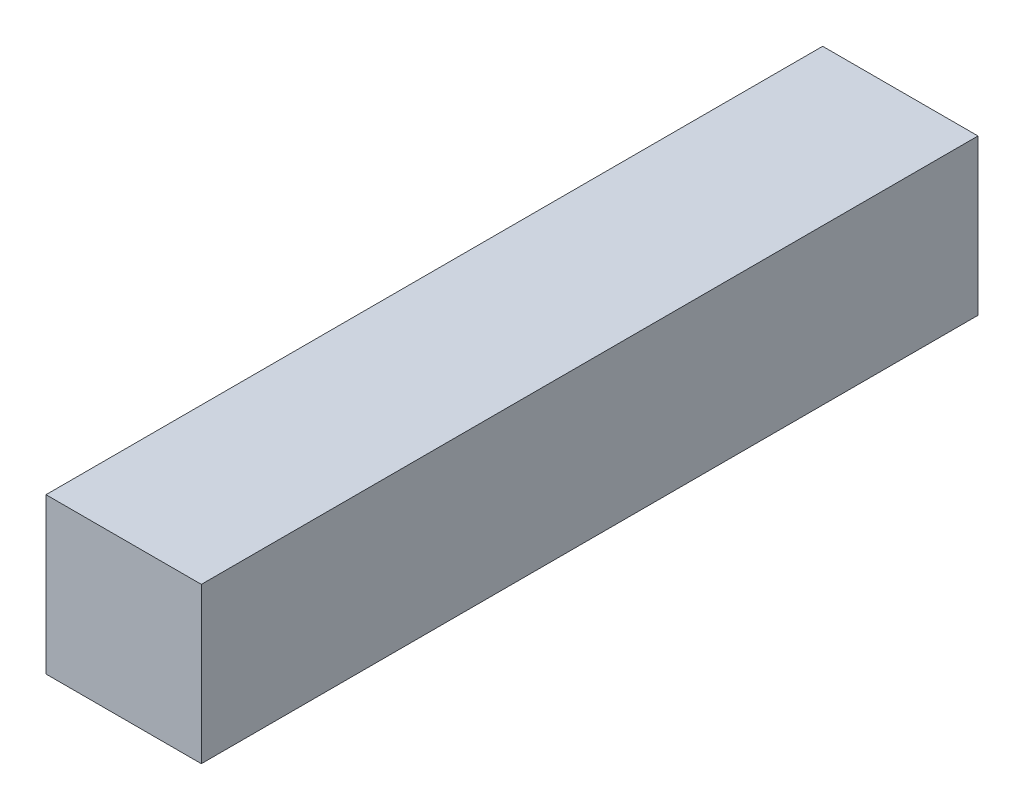
ISO-10303-21;
HEADER;
FILE_DESCRIPTION(('STEP AP214'),'2;1');
FILE_NAME('part.step','',(''),(''),'','','');
FILE_SCHEMA(('AUTOMOTIVE_DESIGN { 1 0 10303 214 1 1 1 1 }'));
ENDSEC;
DATA;
#1=APPLICATION_CONTEXT('core data for automotive mechanical design processes');
#2=APPLICATION_PROTOCOL_DEFINITION('international standard','automotive_design',2000,#1);
#3=PRODUCT_CONTEXT('',#1,'mechanical');
#4=PRODUCT('Part','Part','',(#3));
#5=PRODUCT_RELATED_PRODUCT_CATEGORY('part','',(#4));
#6=PRODUCT_DEFINITION_FORMATION('','',#4);
#7=PRODUCT_DEFINITION_CONTEXT('part definition',#1,'design');
#8=PRODUCT_DEFINITION('design','',#6,#7);
#9=PRODUCT_DEFINITION_SHAPE('','',#8);
#10=(LENGTH_UNIT() NAMED_UNIT(*) SI_UNIT(.MILLI.,.METRE.));
#11=(NAMED_UNIT(*) PLANE_ANGLE_UNIT() SI_UNIT($,.RADIAN.));
#12=(NAMED_UNIT(*) SI_UNIT($,.STERADIAN.) SOLID_ANGLE_UNIT());
#13=UNCERTAINTY_MEASURE_WITH_UNIT(LENGTH_MEASURE(1.E-05),#10,'distance_accuracy_value','');
#14=(GEOMETRIC_REPRESENTATION_CONTEXT(3) GLOBAL_UNCERTAINTY_ASSIGNED_CONTEXT((#13)) GLOBAL_UNIT_ASSIGNED_CONTEXT((#10,
#11,#12)) REPRESENTATION_CONTEXT('',''));
#15=CARTESIAN_POINT('',(0.,0.,0.));
#16=DIRECTION('',(0.,0.,1.));
#17=DIRECTION('',(1.,0.,0.));
#18=AXIS2_PLACEMENT_3D('',#15,#16,#17);
#19=CARTESIAN_POINT('',(-2.,-2.,20.));
#20=DIRECTION('',(0.,1.,0.));
#21=DIRECTION('',(-1.,0.,0.));
#22=AXIS2_PLACEMENT_3D('',#19,#20,#21);
#23=PLANE('',#22);
#24=DIRECTION('',(1.,0.,0.));
#25=VECTOR('',#24,1.);
#26=CARTESIAN_POINT('',(-2.,-2.,0.));
#27=LINE('',#26,#25);
#28=CARTESIAN_POINT('',(-2.,-2.,0.));
#29=VERTEX_POINT('',#28);
#30=CARTESIAN_POINT('',(2.,-2.,0.));
#31=VERTEX_POINT('',#30);
#32=EDGE_CURVE('E105',#29,#31,#27,.T.);
#33=ORIENTED_EDGE('',*,*,#32,.T.);
#34=DIRECTION('',(0.,0.,-1.));
#35=VECTOR('',#34,1.);
#36=CARTESIAN_POINT('',(2.,-2.,20.));
#37=LINE('',#36,#35);
#38=CARTESIAN_POINT('',(2.,-2.,20.));
#39=VERTEX_POINT('',#38);
#40=EDGE_CURVE('E11',#39,#31,#37,.T.);
#41=ORIENTED_EDGE('',*,*,#40,.F.);
#42=DIRECTION('',(1.,0.,0.));
#43=VECTOR('',#42,1.);
#44=CARTESIAN_POINT('',(-2.,-2.,20.));
#45=LINE('',#44,#43);
#46=CARTESIAN_POINT('',(-2.,-2.,20.));
#47=VERTEX_POINT('',#46);
#48=EDGE_CURVE('E89',#47,#39,#45,.T.);
#49=ORIENTED_EDGE('',*,*,#48,.F.);
#50=DIRECTION('',(0.,0.,-1.));
#51=VECTOR('',#50,1.);
#52=CARTESIAN_POINT('',(-2.,-2.,20.));
#53=LINE('',#52,#51);
#54=EDGE_CURVE('E97',#47,#29,#53,.T.);
#55=ORIENTED_EDGE('',*,*,#54,.T.);
#56=EDGE_LOOP('',(#33,#41,#49,#55));
#57=FACE_BOUND('',#56,.T.);
#58=ADVANCED_FACE('F39',(#57),#23,.F.);
#59=CARTESIAN_POINT('',(2.,2.,20.));
#60=DIRECTION('',(-1.,0.,0.));
#61=DIRECTION('',(0.,-1.,0.));
#62=AXIS2_PLACEMENT_3D('',#59,#60,#61);
#63=PLANE('',#62);
#64=DIRECTION('',(0.,1.,0.));
#65=VECTOR('',#64,1.);
#66=CARTESIAN_POINT('',(2.,2.,0.));
#67=LINE('',#66,#65);
#68=CARTESIAN_POINT('',(2.,2.,0.));
#69=VERTEX_POINT('',#68);
#70=EDGE_CURVE('E92',#31,#69,#67,.T.);
#71=ORIENTED_EDGE('',*,*,#70,.T.);
#72=DIRECTION('',(0.,0.,-1.));
#73=VECTOR('',#72,1.);
#74=CARTESIAN_POINT('',(2.,2.,20.));
#75=LINE('',#74,#73);
#76=CARTESIAN_POINT('',(2.,2.,20.));
#77=VERTEX_POINT('',#76);
#78=EDGE_CURVE('E50',#77,#69,#75,.T.);
#79=ORIENTED_EDGE('',*,*,#78,.F.);
#80=DIRECTION('',(0.,1.,0.));
#81=VECTOR('',#80,1.);
#82=CARTESIAN_POINT('',(2.,2.,20.));
#83=LINE('',#82,#81);
#84=EDGE_CURVE('E82',#39,#77,#83,.T.);
#85=ORIENTED_EDGE('',*,*,#84,.F.);
#86=ORIENTED_EDGE('',*,*,#40,.T.);
#87=EDGE_LOOP('',(#71,#79,#85,#86));
#88=FACE_BOUND('',#87,.T.);
#89=ADVANCED_FACE('F93',(#88),#63,.F.);
#90=CARTESIAN_POINT('',(-2.,2.,20.));
#91=DIRECTION('',(0.,-1.,0.));
#92=DIRECTION('',(1.,0.,0.));
#93=AXIS2_PLACEMENT_3D('',#90,#91,#92);
#94=PLANE('',#93);
#95=DIRECTION('',(-1.,0.,0.));
#96=VECTOR('',#95,1.);
#97=CARTESIAN_POINT('',(-2.,2.,0.));
#98=LINE('',#97,#96);
#99=CARTESIAN_POINT('',(-2.,2.,0.));
#100=VERTEX_POINT('',#99);
#101=EDGE_CURVE('E72',#69,#100,#98,.T.);
#102=ORIENTED_EDGE('',*,*,#101,.T.);
#103=DIRECTION('',(0.,0.,-1.));
#104=VECTOR('',#103,1.);
#105=CARTESIAN_POINT('',(-2.,2.,20.));
#106=LINE('',#105,#104);
#107=CARTESIAN_POINT('',(-2.,2.,20.));
#108=VERTEX_POINT('',#107);
#109=EDGE_CURVE('E94',#108,#100,#106,.T.);
#110=ORIENTED_EDGE('',*,*,#109,.F.);
#111=DIRECTION('',(-1.,0.,0.));
#112=VECTOR('',#111,1.);
#113=CARTESIAN_POINT('',(-2.,2.,20.));
#114=LINE('',#113,#112);
#115=EDGE_CURVE('E88',#77,#108,#114,.T.);
#116=ORIENTED_EDGE('',*,*,#115,.F.);
#117=ORIENTED_EDGE('',*,*,#78,.T.);
#118=EDGE_LOOP('',(#102,#110,#116,#117));
#119=FACE_BOUND('',#118,.T.);
#120=ADVANCED_FACE('F96',(#119),#94,.F.);
#121=CARTESIAN_POINT('',(-2.,2.,20.));
#122=DIRECTION('',(1.,0.,0.));
#123=DIRECTION('',(0.,1.,0.));
#124=AXIS2_PLACEMENT_3D('',#121,#122,#123);
#125=PLANE('',#124);
#126=DIRECTION('',(0.,-1.,0.));
#127=VECTOR('',#126,1.);
#128=CARTESIAN_POINT('',(-2.,2.,0.));
#129=LINE('',#128,#127);
#130=EDGE_CURVE('E76',#100,#29,#129,.T.);
#131=ORIENTED_EDGE('',*,*,#130,.T.);
#132=ORIENTED_EDGE('',*,*,#54,.F.);
#133=DIRECTION('',(0.,-1.,0.));
#134=VECTOR('',#133,1.);
#135=CARTESIAN_POINT('',(-2.,2.,20.));
#136=LINE('',#135,#134);
#137=EDGE_CURVE('E54',#108,#47,#136,.T.);
#138=ORIENTED_EDGE('',*,*,#137,.F.);
#139=ORIENTED_EDGE('',*,*,#109,.T.);
#140=EDGE_LOOP('',(#131,#132,#138,#139));
#141=FACE_BOUND('',#140,.T.);
#142=ADVANCED_FACE('F108',(#141),#125,.F.);
#143=CARTESIAN_POINT('',(0.,0.,20.));
#144=DIRECTION('',(0.,0.,-1.));
#145=DIRECTION('',(-1.,0.,0.));
#146=AXIS2_PLACEMENT_3D('',#143,#144,#145);
#147=PLANE('',#146);
#148=ORIENTED_EDGE('',*,*,#48,.T.);
#149=ORIENTED_EDGE('',*,*,#84,.T.);
#150=ORIENTED_EDGE('',*,*,#115,.T.);
#151=ORIENTED_EDGE('',*,*,#137,.T.);
#152=EDGE_LOOP('',(#148,#149,#150,#151));
#153=FACE_BOUND('',#152,.T.);
#154=ADVANCED_FACE('F86',(#153),#147,.F.);
#155=CARTESIAN_POINT('',(0.,0.,0.));
#156=DIRECTION('',(0.,0.,-1.));
#157=DIRECTION('',(-1.,0.,0.));
#158=AXIS2_PLACEMENT_3D('',#155,#156,#157);
#159=PLANE('',#158);
#160=ORIENTED_EDGE('',*,*,#32,.F.);
#161=ORIENTED_EDGE('',*,*,#130,.F.);
#162=ORIENTED_EDGE('',*,*,#101,.F.);
#163=ORIENTED_EDGE('',*,*,#70,.F.);
#164=EDGE_LOOP('',(#160,#161,#162,#163));
#165=FACE_BOUND('',#164,.T.);
#166=ADVANCED_FACE('F115',(#165),#159,.T.);
#167=CLOSED_SHELL('',(#58,#89,#120,#142,#154,#166));
#168=MANIFOLD_SOLID_BREP('B2',#167);
#169=ADVANCED_BREP_SHAPE_REPRESENTATION('',(#18,#168),#14);
#170=SHAPE_DEFINITION_REPRESENTATION(#9,#169);
ENDSEC;
END-ISO-10303-21;
